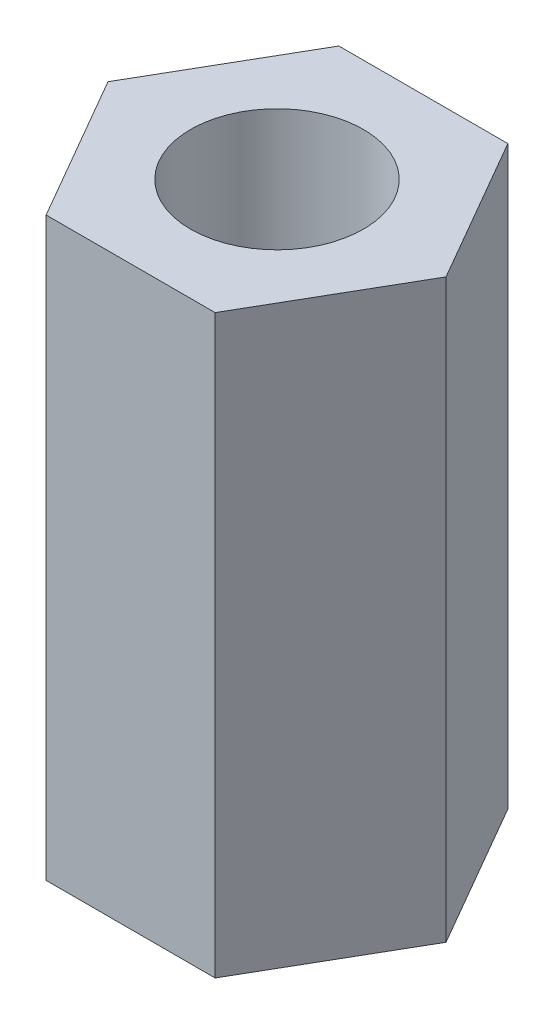
ISO-10303-21;
HEADER;
FILE_DESCRIPTION(('STEP AP214'),'2;1');
FILE_NAME('part.step','',(''),(''),'','','');
FILE_SCHEMA(('AUTOMOTIVE_DESIGN { 1 0 10303 214 1 1 1 1 }'));
ENDSEC;
DATA;
#1=APPLICATION_CONTEXT('core data for automotive mechanical design processes');
#2=APPLICATION_PROTOCOL_DEFINITION('international standard','automotive_design',2000,#1);
#3=PRODUCT_CONTEXT('',#1,'mechanical');
#4=PRODUCT('Part','Part','',(#3));
#5=PRODUCT_RELATED_PRODUCT_CATEGORY('part','',(#4));
#6=PRODUCT_DEFINITION_FORMATION('','',#4);
#7=PRODUCT_DEFINITION_CONTEXT('part definition',#1,'design');
#8=PRODUCT_DEFINITION('design','',#6,#7);
#9=PRODUCT_DEFINITION_SHAPE('','',#8);
#10=(LENGTH_UNIT() NAMED_UNIT(*) SI_UNIT(.MILLI.,.METRE.));
#11=(NAMED_UNIT(*) PLANE_ANGLE_UNIT() SI_UNIT($,.RADIAN.));
#12=(NAMED_UNIT(*) SI_UNIT($,.STERADIAN.) SOLID_ANGLE_UNIT());
#13=UNCERTAINTY_MEASURE_WITH_UNIT(LENGTH_MEASURE(1.E-05),#10,'distance_accuracy_value','');
#14=(GEOMETRIC_REPRESENTATION_CONTEXT(3) GLOBAL_UNCERTAINTY_ASSIGNED_CONTEXT((#13)) GLOBAL_UNIT_ASSIGNED_CONTEXT((#10,
#11,#12)) REPRESENTATION_CONTEXT('',''));
#15=CARTESIAN_POINT('',(0.,0.,0.));
#16=DIRECTION('',(0.,0.,1.));
#17=DIRECTION('',(1.,0.,0.));
#18=AXIS2_PLACEMENT_3D('',#15,#16,#17);
#19=CARTESIAN_POINT('',(0.,10.,0.));
#20=DIRECTION('',(0.,-1.,0.));
#21=DIRECTION('',(0.,0.,-1.));
#22=AXIS2_PLACEMENT_3D('',#19,#20,#21);
#23=PLANE('',#22);
#24=DIRECTION('',(0.5,0.,-0.866025403784439));
#25=VECTOR('',#24,1.);
#26=CARTESIAN_POINT('',(1.46646968374165,10.,2.54));
#27=LINE('',#26,#25);
#28=CARTESIAN_POINT('',(1.46646968374165,10.,2.54));
#29=VERTEX_POINT('',#28);
#30=CARTESIAN_POINT('',(2.9329393674833,10.,0.));
#31=VERTEX_POINT('',#30);
#32=EDGE_CURVE('E156',#29,#31,#27,.T.);
#33=ORIENTED_EDGE('',*,*,#32,.T.);
#34=DIRECTION('',(-0.5,0.,-0.866025403784439));
#35=VECTOR('',#34,1.);
#36=CARTESIAN_POINT('',(1.46646968374165,10.,-2.54));
#37=LINE('',#36,#35);
#38=CARTESIAN_POINT('',(1.46646968374165,10.,-2.54));
#39=VERTEX_POINT('',#38);
#40=EDGE_CURVE('E104',#31,#39,#37,.T.);
#41=ORIENTED_EDGE('',*,*,#40,.T.);
#42=DIRECTION('',(-1.,0.,0.));
#43=VECTOR('',#42,1.);
#44=CARTESIAN_POINT('',(1.46646968374165,10.,-2.54));
#45=LINE('',#44,#43);
#46=CARTESIAN_POINT('',(-1.46646968374165,10.,-2.54));
#47=VERTEX_POINT('',#46);
#48=EDGE_CURVE('E117',#39,#47,#45,.T.);
#49=ORIENTED_EDGE('',*,*,#48,.T.);
#50=DIRECTION('',(-0.5,0.,0.866025403784439));
#51=VECTOR('',#50,1.);
#52=CARTESIAN_POINT('',(-1.46646968374165,10.,-2.54));
#53=LINE('',#52,#51);
#54=CARTESIAN_POINT('',(-2.9329393674833,10.,0.));
#55=VERTEX_POINT('',#54);
#56=EDGE_CURVE('E111',#47,#55,#53,.T.);
#57=ORIENTED_EDGE('',*,*,#56,.T.);
#58=DIRECTION('',(0.5,0.,0.866025403784439));
#59=VECTOR('',#58,1.);
#60=CARTESIAN_POINT('',(-1.46646968374165,10.,2.54));
#61=LINE('',#60,#59);
#62=CARTESIAN_POINT('',(-1.46646968374165,10.,2.54));
#63=VERTEX_POINT('',#62);
#64=EDGE_CURVE('E115',#55,#63,#61,.T.);
#65=ORIENTED_EDGE('',*,*,#64,.T.);
#66=DIRECTION('',(1.,0.,0.));
#67=VECTOR('',#66,1.);
#68=CARTESIAN_POINT('',(1.46646968374165,10.,2.54));
#69=LINE('',#68,#67);
#70=EDGE_CURVE('E67',#63,#29,#69,.T.);
#71=ORIENTED_EDGE('',*,*,#70,.T.);
#72=EDGE_LOOP('',(#33,#41,#49,#57,#65,#71));
#73=FACE_BOUND('',#72,.T.);
#74=CARTESIAN_POINT('',(0.,10.,0.));
#75=DIRECTION('',(0.,1.,0.));
#76=DIRECTION('',(0.,0.,1.));
#77=AXIS2_PLACEMENT_3D('',#74,#75,#76);
#78=CIRCLE('',#77,1.5);
#79=CARTESIAN_POINT('',(0.,10.,1.5));
#80=VERTEX_POINT('',#79);
#81=EDGE_CURVE('E144',#80,#80,#78,.T.);
#82=ORIENTED_EDGE('',*,*,#81,.F.);
#83=EDGE_LOOP('',(#82));
#84=FACE_BOUND('',#83,.T.);
#85=ADVANCED_FACE('F49',(#73,#84),#23,.F.);
#86=CARTESIAN_POINT('',(0.,0.,0.));
#87=DIRECTION('',(0.,-1.,0.));
#88=DIRECTION('',(0.,0.,-1.));
#89=AXIS2_PLACEMENT_3D('',#86,#87,#88);
#90=PLANE('',#89);
#91=DIRECTION('',(0.5,0.,-0.866025403784439));
#92=VECTOR('',#91,1.);
#93=CARTESIAN_POINT('',(1.46646968374165,0.,2.54));
#94=LINE('',#93,#92);
#95=CARTESIAN_POINT('',(1.46646968374165,0.,2.54));
#96=VERTEX_POINT('',#95);
#97=CARTESIAN_POINT('',(2.9329393674833,0.,0.));
#98=VERTEX_POINT('',#97);
#99=EDGE_CURVE('E139',#96,#98,#94,.T.);
#100=ORIENTED_EDGE('',*,*,#99,.F.);
#101=DIRECTION('',(1.,0.,0.));
#102=VECTOR('',#101,1.);
#103=CARTESIAN_POINT('',(1.46646968374165,0.,2.54));
#104=LINE('',#103,#102);
#105=CARTESIAN_POINT('',(-1.46646968374165,0.,2.54));
#106=VERTEX_POINT('',#105);
#107=EDGE_CURVE('E96',#106,#96,#104,.T.);
#108=ORIENTED_EDGE('',*,*,#107,.F.);
#109=DIRECTION('',(0.5,0.,0.866025403784439));
#110=VECTOR('',#109,1.);
#111=CARTESIAN_POINT('',(-1.46646968374165,0.,2.54));
#112=LINE('',#111,#110);
#113=CARTESIAN_POINT('',(-2.9329393674833,0.,0.));
#114=VERTEX_POINT('',#113);
#115=EDGE_CURVE('E90',#114,#106,#112,.T.);
#116=ORIENTED_EDGE('',*,*,#115,.F.);
#117=DIRECTION('',(-0.5,0.,0.866025403784439));
#118=VECTOR('',#117,1.);
#119=CARTESIAN_POINT('',(-1.46646968374165,0.,-2.54));
#120=LINE('',#119,#118);
#121=CARTESIAN_POINT('',(-1.46646968374165,0.,-2.54));
#122=VERTEX_POINT('',#121);
#123=EDGE_CURVE('E126',#122,#114,#120,.T.);
#124=ORIENTED_EDGE('',*,*,#123,.F.);
#125=DIRECTION('',(-1.,0.,0.));
#126=VECTOR('',#125,1.);
#127=CARTESIAN_POINT('',(1.46646968374165,0.,-2.54));
#128=LINE('',#127,#126);
#129=CARTESIAN_POINT('',(1.46646968374165,0.,-2.54));
#130=VERTEX_POINT('',#129);
#131=EDGE_CURVE('E147',#130,#122,#128,.T.);
#132=ORIENTED_EDGE('',*,*,#131,.F.);
#133=DIRECTION('',(-0.5,0.,-0.866025403784439));
#134=VECTOR('',#133,1.);
#135=CARTESIAN_POINT('',(1.46646968374165,0.,-2.54));
#136=LINE('',#135,#134);
#137=EDGE_CURVE('E143',#98,#130,#136,.T.);
#138=ORIENTED_EDGE('',*,*,#137,.F.);
#139=EDGE_LOOP('',(#100,#108,#116,#124,#132,#138));
#140=FACE_BOUND('',#139,.T.);
#141=CARTESIAN_POINT('',(0.,0.,0.));
#142=DIRECTION('',(0.,1.,0.));
#143=DIRECTION('',(0.,0.,1.));
#144=AXIS2_PLACEMENT_3D('',#141,#142,#143);
#145=CIRCLE('',#144,1.5);
#146=CARTESIAN_POINT('',(0.,0.,1.5));
#147=VERTEX_POINT('',#146);
#148=EDGE_CURVE('E289',#147,#147,#145,.T.);
#149=ORIENTED_EDGE('',*,*,#148,.T.);
#150=EDGE_LOOP('',(#149));
#151=FACE_BOUND('',#150,.T.);
#152=ADVANCED_FACE('F169',(#140,#151),#90,.T.);
#153=CARTESIAN_POINT('',(1.46646968374165,10.,2.54));
#154=DIRECTION('',(-0.866025403784439,0.,-0.5));
#155=DIRECTION('',(-0.5,0.,0.866025403784439));
#156=AXIS2_PLACEMENT_3D('',#153,#154,#155);
#157=PLANE('',#156);
#158=ORIENTED_EDGE('',*,*,#99,.T.);
#159=DIRECTION('',(0.,-1.,0.));
#160=VECTOR('',#159,1.);
#161=CARTESIAN_POINT('',(2.9329393674833,10.,0.));
#162=LINE('',#161,#160);
#163=EDGE_CURVE('E11',#31,#98,#162,.T.);
#164=ORIENTED_EDGE('',*,*,#163,.F.);
#165=ORIENTED_EDGE('',*,*,#32,.F.);
#166=DIRECTION('',(0.,-1.,0.));
#167=VECTOR('',#166,1.);
#168=CARTESIAN_POINT('',(1.46646968374165,10.,2.54));
#169=LINE('',#168,#167);
#170=EDGE_CURVE('E135',#29,#96,#169,.T.);
#171=ORIENTED_EDGE('',*,*,#170,.T.);
#172=EDGE_LOOP('',(#158,#164,#165,#171));
#173=FACE_BOUND('',#172,.T.);
#174=ADVANCED_FACE('F51',(#173),#157,.F.);
#175=CARTESIAN_POINT('',(1.46646968374165,10.,-2.54));
#176=DIRECTION('',(-0.866025403784439,0.,0.5));
#177=DIRECTION('',(0.5,0.,0.866025403784439));
#178=AXIS2_PLACEMENT_3D('',#175,#176,#177);
#179=PLANE('',#178);
#180=ORIENTED_EDGE('',*,*,#137,.T.);
#181=DIRECTION('',(0.,-1.,0.));
#182=VECTOR('',#181,1.);
#183=CARTESIAN_POINT('',(1.46646968374165,10.,-2.54));
#184=LINE('',#183,#182);
#185=EDGE_CURVE('E59',#39,#130,#184,.T.);
#186=ORIENTED_EDGE('',*,*,#185,.F.);
#187=ORIENTED_EDGE('',*,*,#40,.F.);
#188=ORIENTED_EDGE('',*,*,#163,.T.);
#189=EDGE_LOOP('',(#180,#186,#187,#188));
#190=FACE_BOUND('',#189,.T.);
#191=ADVANCED_FACE('F194',(#190),#179,.F.);
#192=CARTESIAN_POINT('',(1.46646968374165,10.,-2.54));
#193=DIRECTION('',(0.,0.,1.));
#194=DIRECTION('',(1.,0.,0.));
#195=AXIS2_PLACEMENT_3D('',#192,#193,#194);
#196=PLANE('',#195);
#197=ORIENTED_EDGE('',*,*,#131,.T.);
#198=DIRECTION('',(0.,-1.,0.));
#199=VECTOR('',#198,1.);
#200=CARTESIAN_POINT('',(-1.46646968374165,10.,-2.54));
#201=LINE('',#200,#199);
#202=EDGE_CURVE('E128',#47,#122,#201,.T.);
#203=ORIENTED_EDGE('',*,*,#202,.F.);
#204=ORIENTED_EDGE('',*,*,#48,.F.);
#205=ORIENTED_EDGE('',*,*,#185,.T.);
#206=EDGE_LOOP('',(#197,#203,#204,#205));
#207=FACE_BOUND('',#206,.T.);
#208=ADVANCED_FACE('F166',(#207),#196,.F.);
#209=CARTESIAN_POINT('',(-1.46646968374165,10.,-2.54));
#210=DIRECTION('',(0.866025403784439,0.,0.5));
#211=DIRECTION('',(0.5,0.,-0.866025403784439));
#212=AXIS2_PLACEMENT_3D('',#209,#210,#211);
#213=PLANE('',#212);
#214=ORIENTED_EDGE('',*,*,#123,.T.);
#215=DIRECTION('',(0.,-1.,0.));
#216=VECTOR('',#215,1.);
#217=CARTESIAN_POINT('',(-2.9329393674833,10.,0.));
#218=LINE('',#217,#216);
#219=EDGE_CURVE('E123',#55,#114,#218,.T.);
#220=ORIENTED_EDGE('',*,*,#219,.F.);
#221=ORIENTED_EDGE('',*,*,#56,.F.);
#222=ORIENTED_EDGE('',*,*,#202,.T.);
#223=EDGE_LOOP('',(#214,#220,#221,#222));
#224=FACE_BOUND('',#223,.T.);
#225=ADVANCED_FACE('F124',(#224),#213,.F.);
#226=CARTESIAN_POINT('',(-1.46646968374165,10.,2.54));
#227=DIRECTION('',(0.866025403784439,0.,-0.5));
#228=DIRECTION('',(-0.5,0.,-0.866025403784439));
#229=AXIS2_PLACEMENT_3D('',#226,#227,#228);
#230=PLANE('',#229);
#231=ORIENTED_EDGE('',*,*,#115,.T.);
#232=DIRECTION('',(0.,-1.,0.));
#233=VECTOR('',#232,1.);
#234=CARTESIAN_POINT('',(-1.46646968374165,10.,2.54));
#235=LINE('',#234,#233);
#236=EDGE_CURVE('E129',#63,#106,#235,.T.);
#237=ORIENTED_EDGE('',*,*,#236,.F.);
#238=ORIENTED_EDGE('',*,*,#64,.F.);
#239=ORIENTED_EDGE('',*,*,#219,.T.);
#240=EDGE_LOOP('',(#231,#237,#238,#239));
#241=FACE_BOUND('',#240,.T.);
#242=ADVANCED_FACE('F131',(#241),#230,.F.);
#243=CARTESIAN_POINT('',(1.46646968374165,10.,2.54));
#244=DIRECTION('',(0.,0.,-1.));
#245=DIRECTION('',(-1.,0.,0.));
#246=AXIS2_PLACEMENT_3D('',#243,#244,#245);
#247=PLANE('',#246);
#248=ORIENTED_EDGE('',*,*,#107,.T.);
#249=ORIENTED_EDGE('',*,*,#170,.F.);
#250=ORIENTED_EDGE('',*,*,#70,.F.);
#251=ORIENTED_EDGE('',*,*,#236,.T.);
#252=EDGE_LOOP('',(#248,#249,#250,#251));
#253=FACE_BOUND('',#252,.T.);
#254=ADVANCED_FACE('F174',(#253),#247,.F.);
#255=CARTESIAN_POINT('',(0.,10.,0.));
#256=DIRECTION('',(0.,-1.,0.));
#257=DIRECTION('',(0.,0.,-1.));
#258=AXIS2_PLACEMENT_3D('',#255,#256,#257);
#259=CYLINDRICAL_SURFACE('',#258,1.5);
#260=ORIENTED_EDGE('',*,*,#81,.T.);
#261=EDGE_LOOP('',(#260));
#262=FACE_BOUND('',#261,.T.);
#263=ORIENTED_EDGE('',*,*,#148,.F.);
#264=EDGE_LOOP('',(#263));
#265=FACE_BOUND('',#264,.T.);
#266=ADVANCED_FACE('F176',(#262,#265),#259,.F.);
#267=CLOSED_SHELL('',(#85,#152,#174,#191,#208,#225,#242,#254,#266));
#268=MANIFOLD_SOLID_BREP('B2',#267);
#269=ADVANCED_BREP_SHAPE_REPRESENTATION('',(#18,#268),#14);
#270=SHAPE_DEFINITION_REPRESENTATION(#9,#269);
ENDSEC;
END-ISO-10303-21;
